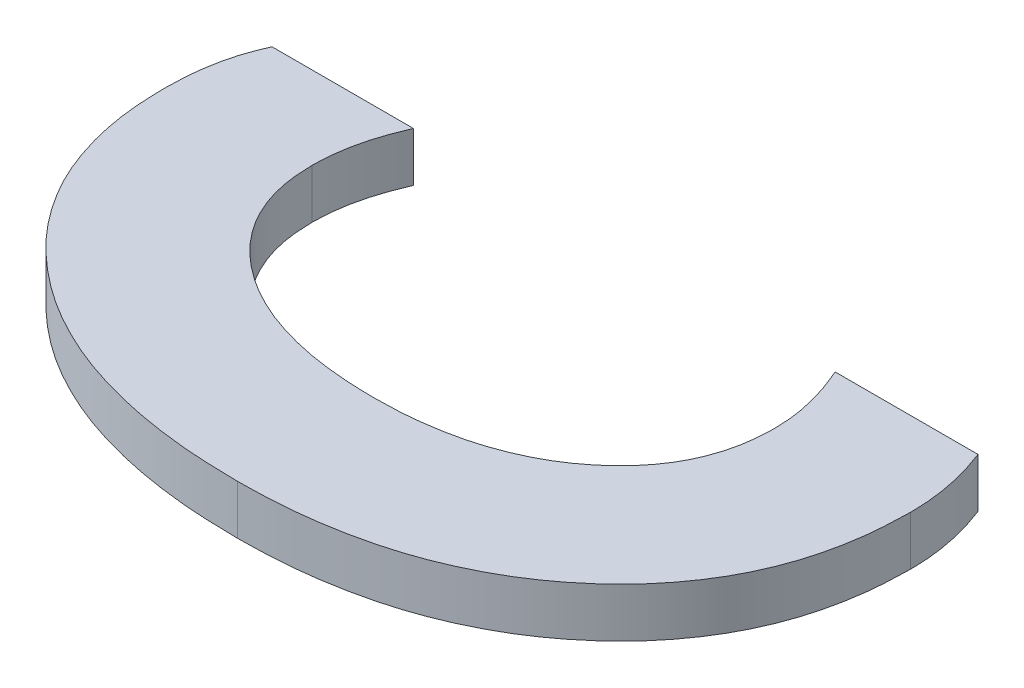
ISO-10303-21;
HEADER;
FILE_DESCRIPTION(('STEP AP214'),'2;1');
FILE_NAME('part.step','',(''),(''),'','','');
FILE_SCHEMA(('AUTOMOTIVE_DESIGN { 1 0 10303 214 1 1 1 1 }'));
ENDSEC;
DATA;
#1=APPLICATION_CONTEXT('core data for automotive mechanical design processes');
#2=APPLICATION_PROTOCOL_DEFINITION('international standard','automotive_design',2000,#1);
#3=PRODUCT_CONTEXT('',#1,'mechanical');
#4=PRODUCT('Part','Part','',(#3));
#5=PRODUCT_RELATED_PRODUCT_CATEGORY('part','',(#4));
#6=PRODUCT_DEFINITION_FORMATION('','',#4);
#7=PRODUCT_DEFINITION_CONTEXT('part definition',#1,'design');
#8=PRODUCT_DEFINITION('design','',#6,#7);
#9=PRODUCT_DEFINITION_SHAPE('','',#8);
#10=(LENGTH_UNIT() NAMED_UNIT(*) SI_UNIT(.MILLI.,.METRE.));
#11=(NAMED_UNIT(*) PLANE_ANGLE_UNIT() SI_UNIT($,.RADIAN.));
#12=(NAMED_UNIT(*) SI_UNIT($,.STERADIAN.) SOLID_ANGLE_UNIT());
#13=UNCERTAINTY_MEASURE_WITH_UNIT(LENGTH_MEASURE(1.E-05),#10,'distance_accuracy_value','');
#14=(GEOMETRIC_REPRESENTATION_CONTEXT(3) GLOBAL_UNCERTAINTY_ASSIGNED_CONTEXT((#13)) GLOBAL_UNIT_ASSIGNED_CONTEXT((#10,
#11,#12)) REPRESENTATION_CONTEXT('',''));
#15=CARTESIAN_POINT('',(0.,0.,0.));
#16=DIRECTION('',(0.,0.,1.));
#17=DIRECTION('',(1.,0.,0.));
#18=AXIS2_PLACEMENT_3D('',#15,#16,#17);
#19=CARTESIAN_POINT('',(2.3402597402597,2.9956,-1.9603896103896));
#20=DIRECTION('',(0.,0.,-1.));
#21=DIRECTION('',(0.,1.,0.));
#22=AXIS2_PLACEMENT_3D('',#19,#20,#21);
#23=PLANE('',#22);
#24=DIRECTION('',(1.,0.,0.));
#25=VECTOR('',#24,1.);
#26=CARTESIAN_POINT('',(2.3402597402597,2.9306,-1.9603896103896));
#27=LINE('',#26,#25);
#28=CARTESIAN_POINT('',(2.3402597402597,2.9306,-1.9603896103896));
#29=VERTEX_POINT('',#28);
#30=CARTESIAN_POINT('',(2.5284090909091,2.9306,-1.9603896103896));
#31=VERTEX_POINT('',#30);
#32=EDGE_CURVE('E11',#29,#31,#27,.T.);
#33=ORIENTED_EDGE('',*,*,#32,.F.);
#34=DIRECTION('',(0.,-1.,0.));
#35=VECTOR('',#34,1.);
#36=CARTESIAN_POINT('',(2.3402597402597,2.9956,-1.9603896103896));
#37=LINE('',#36,#35);
#38=CARTESIAN_POINT('',(2.3402597402597,2.9956,-1.9603896103896));
#39=VERTEX_POINT('',#38);
#40=EDGE_CURVE('E24',#39,#29,#37,.T.);
#41=ORIENTED_EDGE('',*,*,#40,.F.);
#42=DIRECTION('',(1.,0.,0.));
#43=VECTOR('',#42,1.);
#44=CARTESIAN_POINT('',(2.3402597402597,2.9956,-1.9603896103896));
#45=LINE('',#44,#43);
#46=CARTESIAN_POINT('',(2.5284090909091,2.9956,-1.9603896103896));
#47=VERTEX_POINT('',#46);
#48=EDGE_CURVE('E259',#39,#47,#45,.T.);
#49=ORIENTED_EDGE('',*,*,#48,.T.);
#50=DIRECTION('',(0.,-1.,0.));
#51=VECTOR('',#50,1.);
#52=CARTESIAN_POINT('',(2.5284090909091,2.9956,-1.9603896103896));
#53=LINE('',#52,#51);
#54=EDGE_CURVE('E114',#47,#31,#53,.T.);
#55=ORIENTED_EDGE('',*,*,#54,.T.);
#56=EDGE_LOOP('',(#33,#41,#49,#55));
#57=FACE_BOUND('',#56,.T.);
#58=ADVANCED_FACE('F17',(#57),#23,.T.);
#59=CARTESIAN_POINT('',(2.3649350649351,2.9956,-1.8557122564935));
#60=CARTESIAN_POINT('',(2.3649350649351,2.9306,-1.8557122564935));
#61=CARTESIAN_POINT('',(2.3646516452264,2.9956,-1.8642830245299));
#62=CARTESIAN_POINT('',(2.3646516452264,2.9306,-1.8642830245299));
#63=CARTESIAN_POINT('',(2.3640761804689,2.9956,-1.8816853956416));
#64=CARTESIAN_POINT('',(2.3640761804689,2.9306,-1.8816853956416));
#65=CARTESIAN_POINT('',(2.3588395500061,2.9956,-1.9078079689592));
#66=CARTESIAN_POINT('',(2.3588395500061,2.9306,-1.9078079689592));
#67=CARTESIAN_POINT('',(2.3512771652918,2.9956,-1.934333056613));
#68=CARTESIAN_POINT('',(2.3512771652918,2.9306,-1.934333056613));
#69=CARTESIAN_POINT('',(2.343980947344,2.9956,-1.9515888395903));
#70=CARTESIAN_POINT('',(2.343980947344,2.9306,-1.9515888395903));
#71=CARTESIAN_POINT('',(2.3402597402597,2.9956,-1.9603896103896));
#72=CARTESIAN_POINT('',(2.3402597402597,2.9306,-1.9603896103896));
#73=B_SPLINE_SURFACE_WITH_KNOTS('',3,1,((#59,#60),(#61,#62),(#63,#64),(#65,#66),(#67,#68),(#69,
#70),(#71,#72)),.UNSPECIFIED.,.F.,.F.,.F.,(4,1,1,1,4),(2,2),(0.,0.23716183637066,
0.481541242571344,0.735576374652706,1.),(0.,1.),.UNSPECIFIED.);
#74=CARTESIAN_POINT('',(2.3649350649351,2.9306,-1.8557122564935));
#75=CARTESIAN_POINT('',(2.3646516452264,2.9306,-1.8642830245299));
#76=CARTESIAN_POINT('',(2.3640761804689,2.9306,-1.8816853956416));
#77=CARTESIAN_POINT('',(2.3588395500061,2.9306,-1.9078079689592));
#78=CARTESIAN_POINT('',(2.3512771652918,2.9306,-1.934333056613));
#79=CARTESIAN_POINT('',(2.343980947344,2.9306,-1.9515888395903));
#80=CARTESIAN_POINT('',(2.3402597402597,2.9306,-1.9603896103896));
#81=B_SPLINE_CURVE_WITH_KNOTS('',3,(#74,#75,#76,#77,#78,#79,#80),.UNSPECIFIED.,.F.,.F.,(4,1,1,1,
4),(0.,0.23716183637066,0.481541242571344,0.735576374652706,1.),.UNSPECIFIED.);
#82=CARTESIAN_POINT('',(2.3649350649351,2.9306,-1.8557122564935));
#83=VERTEX_POINT('',#82);
#84=EDGE_CURVE('E251',#83,#29,#81,.T.);
#85=DIRECTION('',(0.,-1.,0.));
#86=VECTOR('',#85,1.);
#87=CARTESIAN_POINT('',(2.3649350649351,2.9956,-1.8557122564935));
#88=LINE('',#87,#86);
#89=CARTESIAN_POINT('',(2.3649350649351,2.9956,-1.8557122564935));
#90=VERTEX_POINT('',#89);
#91=EDGE_CURVE('E245',#90,#83,#88,.T.);
#92=CARTESIAN_POINT('',(2.3649350649351,2.9956,-1.8557122564935));
#93=CARTESIAN_POINT('',(2.3646516452264,2.9956,-1.8642830245299));
#94=CARTESIAN_POINT('',(2.3640761804689,2.9956,-1.8816853956416));
#95=CARTESIAN_POINT('',(2.3588395500061,2.9956,-1.9078079689592));
#96=CARTESIAN_POINT('',(2.3512771652918,2.9956,-1.934333056613));
#97=CARTESIAN_POINT('',(2.343980947344,2.9956,-1.9515888395903));
#98=CARTESIAN_POINT('',(2.3402597402597,2.9956,-1.9603896103896));
#99=B_SPLINE_CURVE_WITH_KNOTS('',3,(#92,#93,#94,#95,#96,#97,#98),.UNSPECIFIED.,.F.,.F.,(4,1,1,1,
4),(0.,0.23716183637066,0.481541242571344,0.735576374652706,1.),.UNSPECIFIED.);
#100=EDGE_CURVE('E237',#90,#39,#99,.T.);
#101=ORIENTED_EDGE('',*,*,#84,.F.);
#102=ORIENTED_EDGE('',*,*,#91,.F.);
#103=ORIENTED_EDGE('',*,*,#100,.T.);
#104=ORIENTED_EDGE('',*,*,#40,.T.);
#105=EDGE_LOOP('',(#101,#102,#103,#104));
#106=FACE_BOUND('',#105,.T.);
#107=ADVANCED_FACE('F261',(#106),#73,.T.);
#108=CARTESIAN_POINT('',(2.0665178571429,2.9956,-1.6272727272727));
#109=CARTESIAN_POINT('',(2.0665178571429,2.9306,-1.6272727272727));
#110=CARTESIAN_POINT('',(2.0773855002626,2.9956,-1.6274322584116));
#111=CARTESIAN_POINT('',(2.0773855002626,2.9306,-1.6274322584116));
#112=CARTESIAN_POINT('',(2.0986527906697,2.9956,-1.6277444507628));
#113=CARTESIAN_POINT('',(2.0986527906697,2.9306,-1.6277444507628));
#114=CARTESIAN_POINT('',(2.1296985897034,2.9956,-1.6309267728761));
#115=CARTESIAN_POINT('',(2.1296985897034,2.9306,-1.6309267728761));
#116=CARTESIAN_POINT('',(2.1591421145793,2.9956,-1.6359050280684));
#117=CARTESIAN_POINT('',(2.1591421145793,2.9306,-1.6359050280684));
#118=CARTESIAN_POINT('',(2.1870393043749,2.9956,-1.6427727970921));
#119=CARTESIAN_POINT('',(2.1870393043749,2.9306,-1.6427727970921));
#120=CARTESIAN_POINT('',(2.2133258583675,2.9956,-1.651894046036));
#121=CARTESIAN_POINT('',(2.2133258583675,2.9306,-1.651894046036));
#122=CARTESIAN_POINT('',(2.2380710195503,2.9956,-1.6628415214763));
#123=CARTESIAN_POINT('',(2.2380710195503,2.9306,-1.6628415214763));
#124=CARTESIAN_POINT('',(2.2612188226648,2.9956,-1.675828590491));
#125=CARTESIAN_POINT('',(2.2612188226648,2.9306,-1.675828590491));
#126=CARTESIAN_POINT('',(2.2824861032711,2.9956,-1.6908034745585));
#127=CARTESIAN_POINT('',(2.2824861032711,2.9306,-1.6908034745585));
#128=CARTESIAN_POINT('',(2.3017538930147,2.9956,-1.7073074147526));
#129=CARTESIAN_POINT('',(2.3017538930147,2.9306,-1.7073074147526));
#130=CARTESIAN_POINT('',(2.3186528428061,2.9956,-1.7251139200052));
#131=CARTESIAN_POINT('',(2.3186528428061,2.9306,-1.7251139200052));
#132=CARTESIAN_POINT('',(2.3330044543137,2.9956,-1.7440259148456));
#133=CARTESIAN_POINT('',(2.3330044543137,2.9306,-1.7440259148456));
#134=CARTESIAN_POINT('',(2.3447441725659,2.9956,-1.7641453270794));
#135=CARTESIAN_POINT('',(2.3447441725659,2.9306,-1.7641453270794));
#136=CARTESIAN_POINT('',(2.3538355106017,2.9956,-1.7853807912623));
#137=CARTESIAN_POINT('',(2.3538355106017,2.9306,-1.7853807912623));
#138=CARTESIAN_POINT('',(2.3602086092565,2.9956,-1.8078630183926));
#139=CARTESIAN_POINT('',(2.3602086092565,2.9306,-1.8078630183926));
#140=CARTESIAN_POINT('',(2.3641429361599,2.9956,-1.8314128314518));
#141=CARTESIAN_POINT('',(2.3641429361599,2.9306,-1.8314128314518));
#142=CARTESIAN_POINT('',(2.3646685323511,2.9956,-1.8475360751111));
#143=CARTESIAN_POINT('',(2.3646685323511,2.9306,-1.8475360751111));
#144=CARTESIAN_POINT('',(2.3649350649351,2.9956,-1.8557122564935));
#145=CARTESIAN_POINT('',(2.3649350649351,2.9306,-1.8557122564935));
#146=B_SPLINE_SURFACE_WITH_KNOTS('',3,1,((#108,#109),(#110,#111),(#112,#113),(#114,#115),(#116,
#117),(#118,#119),(#120,#121),(#122,#123),(#124,#125),(#126,#127),(#128,#129),(#130,#131),(#132,
#133),(#134,#135),(#136,#137),(#138,#139),(#140,#141),(#142,#143),(#144,#145)),.UNSPECIFIED.,
.F.,.F.,.F.,(4,1,1,1,1,1,1,1,1,1,1,1,1,1,1,1,4),(2,2),(0.,0.0775445214945562,0.151749725301288,
0.222475929546949,0.290553082861427,0.35654823633205,0.420812237081041,0.483446770096068,
0.545668536578931,0.606160701180748,0.664234712114714,0.720556326720081,0.775227221620043,
0.830090160440384,0.884962683813622,0.941663973902234,1.),(0.,1.),.UNSPECIFIED.);
#147=CARTESIAN_POINT('',(2.0665178571429,2.9306,-1.6272727272727));
#148=CARTESIAN_POINT('',(2.0773855002626,2.9306,-1.6274322584116));
#149=CARTESIAN_POINT('',(2.0986527906697,2.9306,-1.6277444507628));
#150=CARTESIAN_POINT('',(2.1296985897034,2.9306,-1.6309267728761));
#151=CARTESIAN_POINT('',(2.1591421145793,2.9306,-1.6359050280684));
#152=CARTESIAN_POINT('',(2.1870393043749,2.9306,-1.6427727970921));
#153=CARTESIAN_POINT('',(2.2133258583675,2.9306,-1.651894046036));
#154=CARTESIAN_POINT('',(2.2380710195503,2.9306,-1.6628415214763));
#155=CARTESIAN_POINT('',(2.2612188226648,2.9306,-1.675828590491));
#156=CARTESIAN_POINT('',(2.2824861032711,2.9306,-1.6908034745585));
#157=CARTESIAN_POINT('',(2.3017538930147,2.9306,-1.7073074147526));
#158=CARTESIAN_POINT('',(2.3186528428061,2.9306,-1.7251139200052));
#159=CARTESIAN_POINT('',(2.3330044543137,2.9306,-1.7440259148456));
#160=CARTESIAN_POINT('',(2.3447441725659,2.9306,-1.7641453270794));
#161=CARTESIAN_POINT('',(2.3538355106017,2.9306,-1.7853807912623));
#162=CARTESIAN_POINT('',(2.3602086092565,2.9306,-1.8078630183926));
#163=CARTESIAN_POINT('',(2.3641429361599,2.9306,-1.8314128314518));
#164=CARTESIAN_POINT('',(2.3646685323511,2.9306,-1.8475360751111));
#165=CARTESIAN_POINT('',(2.3649350649351,2.9306,-1.8557122564935));
#166=B_SPLINE_CURVE_WITH_KNOTS('',3,(#147,#148,#149,#150,#151,#152,#153,#154,#155,#156,#157,
#158,#159,#160,#161,#162,#163,#164,#165),.UNSPECIFIED.,.F.,.F.,(4,1,1,1,1,1,1,1,1,1,1,1,1,1,1,1,
4),(0.,0.0775445214945562,0.151749725301288,0.222475929546949,0.290553082861427,
0.35654823633205,0.420812237081041,0.483446770096068,0.545668536578931,0.606160701180748,
0.664234712114714,0.720556326720081,0.775227221620043,0.830090160440384,0.884962683813622,
0.941663973902234,1.),.UNSPECIFIED.);
#167=CARTESIAN_POINT('',(2.0665178571429,2.9306,-1.6272727272727));
#168=VERTEX_POINT('',#167);
#169=EDGE_CURVE('E232',#168,#83,#166,.T.);
#170=DIRECTION('',(0.,-1.,0.));
#171=VECTOR('',#170,1.);
#172=CARTESIAN_POINT('',(2.0665178571429,2.9956,-1.6272727272727));
#173=LINE('',#172,#171);
#174=CARTESIAN_POINT('',(2.0665178571429,2.9956,-1.6272727272727));
#175=VERTEX_POINT('',#174);
#176=EDGE_CURVE('E226',#175,#168,#173,.T.);
#177=CARTESIAN_POINT('',(2.0665178571429,2.9956,-1.6272727272727));
#178=CARTESIAN_POINT('',(2.0773855002626,2.9956,-1.6274322584116));
#179=CARTESIAN_POINT('',(2.0986527906697,2.9956,-1.6277444507628));
#180=CARTESIAN_POINT('',(2.1296985897034,2.9956,-1.6309267728761));
#181=CARTESIAN_POINT('',(2.1591421145793,2.9956,-1.6359050280684));
#182=CARTESIAN_POINT('',(2.1870393043749,2.9956,-1.6427727970921));
#183=CARTESIAN_POINT('',(2.2133258583675,2.9956,-1.651894046036));
#184=CARTESIAN_POINT('',(2.2380710195503,2.9956,-1.6628415214763));
#185=CARTESIAN_POINT('',(2.2612188226648,2.9956,-1.675828590491));
#186=CARTESIAN_POINT('',(2.2824861032711,2.9956,-1.6908034745585));
#187=CARTESIAN_POINT('',(2.3017538930147,2.9956,-1.7073074147526));
#188=CARTESIAN_POINT('',(2.3186528428061,2.9956,-1.7251139200052));
#189=CARTESIAN_POINT('',(2.3330044543137,2.9956,-1.7440259148456));
#190=CARTESIAN_POINT('',(2.3447441725659,2.9956,-1.7641453270794));
#191=CARTESIAN_POINT('',(2.3538355106017,2.9956,-1.7853807912623));
#192=CARTESIAN_POINT('',(2.3602086092565,2.9956,-1.8078630183926));
#193=CARTESIAN_POINT('',(2.3641429361599,2.9956,-1.8314128314518));
#194=CARTESIAN_POINT('',(2.3646685323511,2.9956,-1.8475360751111));
#195=CARTESIAN_POINT('',(2.3649350649351,2.9956,-1.8557122564935));
#196=B_SPLINE_CURVE_WITH_KNOTS('',3,(#177,#178,#179,#180,#181,#182,#183,#184,#185,#186,#187,
#188,#189,#190,#191,#192,#193,#194,#195),.UNSPECIFIED.,.F.,.F.,(4,1,1,1,1,1,1,1,1,1,1,1,1,1,1,1,
4),(0.,0.0775445214945562,0.151749725301288,0.222475929546949,0.290553082861427,
0.35654823633205,0.420812237081041,0.483446770096068,0.545668536578931,0.606160701180748,
0.664234712114714,0.720556326720081,0.775227221620043,0.830090160440384,0.884962683813622,
0.941663973902234,1.),.UNSPECIFIED.);
#197=EDGE_CURVE('E218',#175,#90,#196,.T.);
#198=ORIENTED_EDGE('',*,*,#169,.F.);
#199=ORIENTED_EDGE('',*,*,#176,.F.);
#200=ORIENTED_EDGE('',*,*,#197,.T.);
#201=ORIENTED_EDGE('',*,*,#91,.T.);
#202=EDGE_LOOP('',(#198,#199,#200,#201));
#203=FACE_BOUND('',#202,.T.);
#204=ADVANCED_FACE('F265',(#203),#146,.T.);
#205=CARTESIAN_POINT('',(1.7603896103896,2.9956,-1.851663961039));
#206=CARTESIAN_POINT('',(1.7603896103896,2.9306,-1.851663961039));
#207=CARTESIAN_POINT('',(1.7606600615359,2.9956,-1.8435528285198));
#208=CARTESIAN_POINT('',(1.7606600615359,2.9306,-1.8435528285198));
#209=CARTESIAN_POINT('',(1.7611933502631,2.9956,-1.8275589028226));
#210=CARTESIAN_POINT('',(1.7611933502631,2.9306,-1.8275589028226));
#211=CARTESIAN_POINT('',(1.7650739435199,2.9956,-1.8041694017406));
#212=CARTESIAN_POINT('',(1.7650739435199,2.9306,-1.8041694017406));
#213=CARTESIAN_POINT('',(1.7716544947004,2.9956,-1.7819415835035));
#214=CARTESIAN_POINT('',(1.7716544947004,2.9306,-1.7819415835035));
#215=CARTESIAN_POINT('',(1.7810306703198,2.9956,-1.761011071647));
#216=CARTESIAN_POINT('',(1.7810306703198,2.9306,-1.761011071647));
#217=CARTESIAN_POINT('',(1.7928509275754,2.9956,-1.7411425514334));
#218=CARTESIAN_POINT('',(1.7928509275754,2.9306,-1.7411425514334));
#219=CARTESIAN_POINT('',(1.8074762111279,2.9956,-1.7226072707774));
#220=CARTESIAN_POINT('',(1.8074762111279,2.9306,-1.7226072707774));
#221=CARTESIAN_POINT('',(1.8245657174604,2.9956,-1.7051139419819));
#222=CARTESIAN_POINT('',(1.8245657174604,2.9306,-1.7051139419819));
#223=CARTESIAN_POINT('',(1.844227484472,2.9956,-1.6890786736688));
#224=CARTESIAN_POINT('',(1.844227484472,2.9306,-1.6890786736688));
#225=CARTESIAN_POINT('',(1.8658889344819,2.9956,-1.6743910632406));
#226=CARTESIAN_POINT('',(1.8658889344819,2.9306,-1.6743910632406));
#227=CARTESIAN_POINT('',(1.8896517649794,2.9956,-1.6619400654834));
#228=CARTESIAN_POINT('',(1.8896517649794,2.9306,-1.6619400654834));
#229=CARTESIAN_POINT('',(1.9149078044388,2.9956,-1.6509958515217));
#230=CARTESIAN_POINT('',(1.9149078044388,2.9306,-1.6509958515217));
#231=CARTESIAN_POINT('',(1.9420425469413,2.9956,-1.6425230590816));
#232=CARTESIAN_POINT('',(1.9420425469413,2.9306,-1.6425230590816));
#233=CARTESIAN_POINT('',(1.9707119984812,2.9956,-1.6353911459008));
#234=CARTESIAN_POINT('',(1.9707119984812,2.9306,-1.6353911459008));
#235=CARTESIAN_POINT('',(2.0011743412063,2.9956,-1.630776527762));
#236=CARTESIAN_POINT('',(2.0011743412063,2.9306,-1.630776527762));
#237=CARTESIAN_POINT('',(2.0332999424843,2.9956,-1.6277811125942));
#238=CARTESIAN_POINT('',(2.0332999424843,2.9306,-1.6277811125942));
#239=CARTESIAN_POINT('',(2.0552653577627,2.9956,-1.6274449417411));
#240=CARTESIAN_POINT('',(2.0552653577627,2.9306,-1.6274449417411));
#241=CARTESIAN_POINT('',(2.0665178571429,2.9956,-1.6272727272727));
#242=CARTESIAN_POINT('',(2.0665178571429,2.9306,-1.6272727272727));
#243=B_SPLINE_SURFACE_WITH_KNOTS('',3,1,((#205,#206),(#207,#208),(#209,#210),(#211,#212),(#213,
#214),(#215,#216),(#217,#218),(#219,#220),(#221,#222),(#223,#224),(#225,#226),(#227,#228),(#229,
#230),(#231,#232),(#233,#234),(#235,#236),(#237,#238),(#239,#240),(#241,#242)),.UNSPECIFIED.,
.F.,.F.,.F.,(4,1,1,1,1,1,1,1,1,1,1,1,1,1,1,1,4),(2,2),(0.,0.0572924959307924,0.112972130679967,
0.166981229647898,0.220638074956462,0.274595628493794,0.329903838679954,0.387050444241429,
0.447040621025498,0.508866662501777,0.571625805181683,0.636306391481121,0.703069427859231,
0.772220993057641,0.844845747875827,0.920517181044396,1.),(0.,1.),.UNSPECIFIED.);
#244=CARTESIAN_POINT('',(1.7603896103896,2.9306,-1.851663961039));
#245=CARTESIAN_POINT('',(1.7606600615359,2.9306,-1.8435528285198));
#246=CARTESIAN_POINT('',(1.7611933502631,2.9306,-1.8275589028226));
#247=CARTESIAN_POINT('',(1.7650739435199,2.9306,-1.8041694017406));
#248=CARTESIAN_POINT('',(1.7716544947004,2.9306,-1.7819415835035));
#249=CARTESIAN_POINT('',(1.7810306703198,2.9306,-1.761011071647));
#250=CARTESIAN_POINT('',(1.7928509275754,2.9306,-1.7411425514334));
#251=CARTESIAN_POINT('',(1.8074762111279,2.9306,-1.7226072707774));
#252=CARTESIAN_POINT('',(1.8245657174604,2.9306,-1.7051139419819));
#253=CARTESIAN_POINT('',(1.844227484472,2.9306,-1.6890786736688));
#254=CARTESIAN_POINT('',(1.8658889344819,2.9306,-1.6743910632406));
#255=CARTESIAN_POINT('',(1.8896517649794,2.9306,-1.6619400654834));
#256=CARTESIAN_POINT('',(1.9149078044388,2.9306,-1.6509958515217));
#257=CARTESIAN_POINT('',(1.9420425469413,2.9306,-1.6425230590816));
#258=CARTESIAN_POINT('',(1.9707119984812,2.9306,-1.6353911459008));
#259=CARTESIAN_POINT('',(2.0011743412063,2.9306,-1.630776527762));
#260=CARTESIAN_POINT('',(2.0332999424843,2.9306,-1.6277811125942));
#261=CARTESIAN_POINT('',(2.0552653577627,2.9306,-1.6274449417411));
#262=CARTESIAN_POINT('',(2.0665178571429,2.9306,-1.6272727272727));
#263=B_SPLINE_CURVE_WITH_KNOTS('',3,(#244,#245,#246,#247,#248,#249,#250,#251,#252,#253,#254,
#255,#256,#257,#258,#259,#260,#261,#262),.UNSPECIFIED.,.F.,.F.,(4,1,1,1,1,1,1,1,1,1,1,1,1,1,1,1,
4),(0.,0.0572924959307924,0.112972130679967,0.166981229647898,0.220638074956462,
0.274595628493794,0.329903838679954,0.387050444241429,0.447040621025498,0.508866662501777,
0.571625805181683,0.636306391481121,0.703069427859231,0.772220993057641,0.844845747875827,
0.920517181044396,1.),.UNSPECIFIED.);
#264=CARTESIAN_POINT('',(1.7603896103896,2.9306,-1.851663961039));
#265=VERTEX_POINT('',#264);
#266=EDGE_CURVE('E213',#265,#168,#263,.T.);
#267=DIRECTION('',(0.,-1.,0.));
#268=VECTOR('',#267,1.);
#269=CARTESIAN_POINT('',(1.7603896103896,2.9956,-1.851663961039));
#270=LINE('',#269,#268);
#271=CARTESIAN_POINT('',(1.7603896103896,2.9956,-1.851663961039));
#272=VERTEX_POINT('',#271);
#273=EDGE_CURVE('E207',#272,#265,#270,.T.);
#274=CARTESIAN_POINT('',(1.7603896103896,2.9956,-1.851663961039));
#275=CARTESIAN_POINT('',(1.7606600615359,2.9956,-1.8435528285198));
#276=CARTESIAN_POINT('',(1.7611933502631,2.9956,-1.8275589028226));
#277=CARTESIAN_POINT('',(1.7650739435199,2.9956,-1.8041694017406));
#278=CARTESIAN_POINT('',(1.7716544947004,2.9956,-1.7819415835035));
#279=CARTESIAN_POINT('',(1.7810306703198,2.9956,-1.761011071647));
#280=CARTESIAN_POINT('',(1.7928509275754,2.9956,-1.7411425514334));
#281=CARTESIAN_POINT('',(1.8074762111279,2.9956,-1.7226072707774));
#282=CARTESIAN_POINT('',(1.8245657174604,2.9956,-1.7051139419819));
#283=CARTESIAN_POINT('',(1.844227484472,2.9956,-1.6890786736688));
#284=CARTESIAN_POINT('',(1.8658889344819,2.9956,-1.6743910632406));
#285=CARTESIAN_POINT('',(1.8896517649794,2.9956,-1.6619400654834));
#286=CARTESIAN_POINT('',(1.9149078044388,2.9956,-1.6509958515217));
#287=CARTESIAN_POINT('',(1.9420425469413,2.9956,-1.6425230590816));
#288=CARTESIAN_POINT('',(1.9707119984812,2.9956,-1.6353911459008));
#289=CARTESIAN_POINT('',(2.0011743412063,2.9956,-1.630776527762));
#290=CARTESIAN_POINT('',(2.0332999424843,2.9956,-1.6277811125942));
#291=CARTESIAN_POINT('',(2.0552653577627,2.9956,-1.6274449417411));
#292=CARTESIAN_POINT('',(2.0665178571429,2.9956,-1.6272727272727));
#293=B_SPLINE_CURVE_WITH_KNOTS('',3,(#274,#275,#276,#277,#278,#279,#280,#281,#282,#283,#284,
#285,#286,#287,#288,#289,#290,#291,#292),.UNSPECIFIED.,.F.,.F.,(4,1,1,1,1,1,1,1,1,1,1,1,1,1,1,1,
4),(0.,0.0572924959307924,0.112972130679967,0.166981229647898,0.220638074956462,
0.274595628493794,0.329903838679954,0.387050444241429,0.447040621025498,0.508866662501777,
0.571625805181683,0.636306391481121,0.703069427859231,0.772220993057641,0.844845747875827,
0.920517181044396,1.),.UNSPECIFIED.);
#294=EDGE_CURVE('E199',#272,#175,#293,.T.);
#295=ORIENTED_EDGE('',*,*,#266,.F.);
#296=ORIENTED_EDGE('',*,*,#273,.F.);
#297=ORIENTED_EDGE('',*,*,#294,.T.);
#298=ORIENTED_EDGE('',*,*,#176,.T.);
#299=EDGE_LOOP('',(#295,#296,#297,#298));
#300=FACE_BOUND('',#299,.T.);
#301=ADVANCED_FACE('F268',(#300),#243,.T.);
#302=CARTESIAN_POINT('',(1.7850649350649,2.9956,-1.9603896103896));
#303=CARTESIAN_POINT('',(1.7850649350649,2.9306,-1.9603896103896));
#304=CARTESIAN_POINT('',(1.7812110797635,2.9956,-1.9510120387157));
#305=CARTESIAN_POINT('',(1.7812110797635,2.9306,-1.9510120387157));
#306=CARTESIAN_POINT('',(1.773751175068,2.9956,-1.9328598805546));
#307=CARTESIAN_POINT('',(1.773751175068,2.9306,-1.9328598805546));
#308=CARTESIAN_POINT('',(1.7659874126836,2.9956,-1.9052031918598));
#309=CARTESIAN_POINT('',(1.7659874126836,2.9306,-1.9052031918598));
#310=CARTESIAN_POINT('',(1.7613751922113,2.9956,-1.8782313353698));
#311=CARTESIAN_POINT('',(1.7613751922113,2.9306,-1.8782313353698));
#312=CARTESIAN_POINT('',(1.7607144380481,2.9956,-1.8604200255344));
#313=CARTESIAN_POINT('',(1.7607144380481,2.9306,-1.8604200255344));
#314=CARTESIAN_POINT('',(1.7603896103896,2.9956,-1.851663961039));
#315=CARTESIAN_POINT('',(1.7603896103896,2.9306,-1.851663961039));
#316=B_SPLINE_SURFACE_WITH_KNOTS('',3,1,((#302,#303),(#304,#305),(#306,#307),(#308,#309),(#310,
#311),(#312,#313),(#314,#315)),.UNSPECIFIED.,.F.,.F.,.F.,(4,1,1,1,4),(2,2),(0.,
0.270753871936456,0.524098058327029,0.766045948707751,1.),(0.,1.),.UNSPECIFIED.);
#317=CARTESIAN_POINT('',(1.7850649350649,2.9306,-1.9603896103896));
#318=CARTESIAN_POINT('',(1.7812110797635,2.9306,-1.9510120387157));
#319=CARTESIAN_POINT('',(1.773751175068,2.9306,-1.9328598805546));
#320=CARTESIAN_POINT('',(1.7659874126836,2.9306,-1.9052031918598));
#321=CARTESIAN_POINT('',(1.7613751922113,2.9306,-1.8782313353698));
#322=CARTESIAN_POINT('',(1.7607144380481,2.9306,-1.8604200255344));
#323=CARTESIAN_POINT('',(1.7603896103896,2.9306,-1.851663961039));
#324=B_SPLINE_CURVE_WITH_KNOTS('',3,(#317,#318,#319,#320,#321,#322,#323),.UNSPECIFIED.,.F.,.F.,
(4,1,1,1,4),(0.,0.270753871936456,0.524098058327029,0.766045948707751,1.),.UNSPECIFIED.);
#325=CARTESIAN_POINT('',(1.7850649350649,2.9306,-1.9603896103896));
#326=VERTEX_POINT('',#325);
#327=EDGE_CURVE('E194',#326,#265,#324,.T.);
#328=DIRECTION('',(0.,-1.,0.));
#329=VECTOR('',#328,1.);
#330=CARTESIAN_POINT('',(1.7850649350649,2.9956,-1.9603896103896));
#331=LINE('',#330,#329);
#332=CARTESIAN_POINT('',(1.7850649350649,2.9956,-1.9603896103896));
#333=VERTEX_POINT('',#332);
#334=EDGE_CURVE('E188',#333,#326,#331,.T.);
#335=CARTESIAN_POINT('',(1.7850649350649,2.9956,-1.9603896103896));
#336=CARTESIAN_POINT('',(1.7812110797635,2.9956,-1.9510120387157));
#337=CARTESIAN_POINT('',(1.773751175068,2.9956,-1.9328598805546));
#338=CARTESIAN_POINT('',(1.7659874126836,2.9956,-1.9052031918598));
#339=CARTESIAN_POINT('',(1.7613751922113,2.9956,-1.8782313353698));
#340=CARTESIAN_POINT('',(1.7607144380481,2.9956,-1.8604200255344));
#341=CARTESIAN_POINT('',(1.7603896103896,2.9956,-1.851663961039));
#342=B_SPLINE_CURVE_WITH_KNOTS('',3,(#335,#336,#337,#338,#339,#340,#341),.UNSPECIFIED.,.F.,.F.,
(4,1,1,1,4),(0.,0.270753871936456,0.524098058327029,0.766045948707751,1.),.UNSPECIFIED.);
#343=EDGE_CURVE('E183',#333,#272,#342,.T.);
#344=ORIENTED_EDGE('',*,*,#327,.F.);
#345=ORIENTED_EDGE('',*,*,#334,.F.);
#346=ORIENTED_EDGE('',*,*,#343,.T.);
#347=ORIENTED_EDGE('',*,*,#273,.T.);
#348=EDGE_LOOP('',(#344,#345,#346,#347));
#349=FACE_BOUND('',#348,.T.);
#350=ADVANCED_FACE('F273',(#349),#316,.T.);
#351=CARTESIAN_POINT('',(1.5988433441558,2.9956,-1.9603896103896));
#352=DIRECTION('',(0.,0.,-1.));
#353=DIRECTION('',(0.,1.,0.));
#354=AXIS2_PLACEMENT_3D('',#351,#352,#353);
#355=PLANE('',#354);
#356=DIRECTION('',(1.,0.,0.));
#357=VECTOR('',#356,1.);
#358=CARTESIAN_POINT('',(1.5988433441558,2.9306,-1.9603896103896));
#359=LINE('',#358,#357);
#360=CARTESIAN_POINT('',(1.5988433441558,2.9306,-1.9603896103896));
#361=VERTEX_POINT('',#360);
#362=EDGE_CURVE('E180',#361,#326,#359,.T.);
#363=ORIENTED_EDGE('',*,*,#362,.F.);
#364=DIRECTION('',(0.,-1.,0.));
#365=VECTOR('',#364,1.);
#366=CARTESIAN_POINT('',(1.5988433441558,2.9956,-1.9603896103896));
#367=LINE('',#366,#365);
#368=CARTESIAN_POINT('',(1.5988433441558,2.9956,-1.9603896103896));
#369=VERTEX_POINT('',#368);
#370=EDGE_CURVE('E177',#369,#361,#367,.T.);
#371=ORIENTED_EDGE('',*,*,#370,.F.);
#372=DIRECTION('',(1.,0.,0.));
#373=VECTOR('',#372,1.);
#374=CARTESIAN_POINT('',(1.5988433441558,2.9956,-1.9603896103896));
#375=LINE('',#374,#373);
#376=EDGE_CURVE('E171',#369,#333,#375,.T.);
#377=ORIENTED_EDGE('',*,*,#376,.T.);
#378=ORIENTED_EDGE('',*,*,#334,.T.);
#379=EDGE_LOOP('',(#363,#371,#377,#378));
#380=FACE_BOUND('',#379,.T.);
#381=ADVANCED_FACE('F275',(#380),#355,.T.);
#382=CARTESIAN_POINT('',(1.5753246753247,2.9956,-1.8422179383117));
#383=CARTESIAN_POINT('',(1.5753246753247,2.9306,-1.8422179383117));
#384=CARTESIAN_POINT('',(1.5755476795032,2.9956,-1.8529661008444));
#385=CARTESIAN_POINT('',(1.5755476795032,2.9306,-1.8529661008444));
#386=CARTESIAN_POINT('',(1.575980875706,2.9956,-1.8738449167806));
#387=CARTESIAN_POINT('',(1.575980875706,2.9306,-1.8738449167806));
#388=CARTESIAN_POINT('',(1.5804027468027,2.9956,-1.9043286493301));
#389=CARTESIAN_POINT('',(1.5804027468027,2.9306,-1.9043286493301));
#390=CARTESIAN_POINT('',(1.5874498552226,2.9956,-1.9333151613331));
#391=CARTESIAN_POINT('',(1.5874498552226,2.9306,-1.9333151613331));
#392=CARTESIAN_POINT('',(1.5950656660256,2.9956,-1.9514126802598));
#393=CARTESIAN_POINT('',(1.5950656660256,2.9306,-1.9514126802598));
#394=CARTESIAN_POINT('',(1.5988433441558,2.9956,-1.9603896103896));
#395=CARTESIAN_POINT('',(1.5988433441558,2.9306,-1.9603896103896));
#396=B_SPLINE_SURFACE_WITH_KNOTS('',3,1,((#382,#383),(#384,#385),(#386,#387),(#388,#389),(#390,
#391),(#392,#393),(#394,#395)),.UNSPECIFIED.,.F.,.F.,.F.,(4,1,1,1,4),(2,2),(0.,
0.265393485193272,0.515539443245717,0.759692553092044,1.),(0.,1.),.UNSPECIFIED.);
#397=CARTESIAN_POINT('',(1.5753246753247,2.9306,-1.8422179383117));
#398=CARTESIAN_POINT('',(1.5755476795032,2.9306,-1.8529661008444));
#399=CARTESIAN_POINT('',(1.575980875706,2.9306,-1.8738449167806));
#400=CARTESIAN_POINT('',(1.5804027468027,2.9306,-1.9043286493301));
#401=CARTESIAN_POINT('',(1.5874498552226,2.9306,-1.9333151613331));
#402=CARTESIAN_POINT('',(1.5950656660256,2.9306,-1.9514126802598));
#403=CARTESIAN_POINT('',(1.5988433441558,2.9306,-1.9603896103896));
#404=B_SPLINE_CURVE_WITH_KNOTS('',3,(#397,#398,#399,#400,#401,#402,#403),.UNSPECIFIED.,.F.,.F.,
(4,1,1,1,4),(0.,0.265393485193272,0.515539443245717,0.759692553092044,1.),.UNSPECIFIED.);
#405=CARTESIAN_POINT('',(1.5753246753247,2.9306,-1.8422179383117));
#406=VERTEX_POINT('',#405);
#407=EDGE_CURVE('E166',#406,#361,#404,.T.);
#408=DIRECTION('',(0.,-1.,0.));
#409=VECTOR('',#408,1.);
#410=CARTESIAN_POINT('',(1.5753246753247,2.9956,-1.8422179383117));
#411=LINE('',#410,#409);
#412=CARTESIAN_POINT('',(1.5753246753247,2.9956,-1.8422179383117));
#413=VERTEX_POINT('',#412);
#414=EDGE_CURVE('E160',#413,#406,#411,.T.);
#415=CARTESIAN_POINT('',(1.5753246753247,2.9956,-1.8422179383117));
#416=CARTESIAN_POINT('',(1.5755476795032,2.9956,-1.8529661008444));
#417=CARTESIAN_POINT('',(1.575980875706,2.9956,-1.8738449167806));
#418=CARTESIAN_POINT('',(1.5804027468027,2.9956,-1.9043286493301));
#419=CARTESIAN_POINT('',(1.5874498552226,2.9956,-1.9333151613331));
#420=CARTESIAN_POINT('',(1.5950656660256,2.9956,-1.9514126802598));
#421=CARTESIAN_POINT('',(1.5988433441558,2.9956,-1.9603896103896));
#422=B_SPLINE_CURVE_WITH_KNOTS('',3,(#415,#416,#417,#418,#419,#420,#421),.UNSPECIFIED.,.F.,.F.,
(4,1,1,1,4),(0.,0.265393485193272,0.515539443245717,0.759692553092044,1.),.UNSPECIFIED.);
#423=EDGE_CURVE('E152',#413,#369,#422,.T.);
#424=ORIENTED_EDGE('',*,*,#407,.F.);
#425=ORIENTED_EDGE('',*,*,#414,.F.);
#426=ORIENTED_EDGE('',*,*,#423,.T.);
#427=ORIENTED_EDGE('',*,*,#370,.T.);
#428=EDGE_LOOP('',(#424,#425,#426,#427));
#429=FACE_BOUND('',#428,.T.);
#430=ADVANCED_FACE('F277',(#429),#396,.T.);
#431=CARTESIAN_POINT('',(2.0715300324675,2.9956,-1.4422077922078));
#432=CARTESIAN_POINT('',(2.0715300324675,2.9306,-1.4422077922078));
#433=CARTESIAN_POINT('',(2.0533958209849,2.9956,-1.4425239848561));
#434=CARTESIAN_POINT('',(2.0533958209849,2.9306,-1.4425239848561));
#435=CARTESIAN_POINT('',(2.0179492528565,2.9956,-1.4431420400861));
#436=CARTESIAN_POINT('',(2.0179492528565,2.9306,-1.4431420400861));
#437=CARTESIAN_POINT('',(1.966146366743,2.9956,-1.4484592470915));
#438=CARTESIAN_POINT('',(1.966146366743,2.9306,-1.4484592470915));
#439=CARTESIAN_POINT('',(1.9170078397133,2.9956,-1.457011137358));
#440=CARTESIAN_POINT('',(1.9170078397133,2.9306,-1.457011137358));
#441=CARTESIAN_POINT('',(1.8706131038443,2.9956,-1.4692250988088));
#442=CARTESIAN_POINT('',(1.8706131038443,2.9306,-1.4692250988088));
#443=CARTESIAN_POINT('',(1.8267435014486,2.9956,-1.4845071825498));
#444=CARTESIAN_POINT('',(1.8267435014486,2.9306,-1.4845071825498));
#445=CARTESIAN_POINT('',(1.7857621218904,2.9956,-1.50382500915));
#446=CARTESIAN_POINT('',(1.7857621218904,2.9306,-1.50382500915));
#447=CARTESIAN_POINT('',(1.7471288959907,2.9956,-1.5260551108983));
#448=CARTESIAN_POINT('',(1.7471288959907,2.9306,-1.5260551108983));
#449=CARTESIAN_POINT('',(1.711834732507,2.9956,-1.5521352211196));
#450=CARTESIAN_POINT('',(1.711834732507,2.9306,-1.5521352211196));
#451=CARTESIAN_POINT('',(1.679832543597,2.9956,-1.5806930524343));
#452=CARTESIAN_POINT('',(1.679832543597,2.9306,-1.5806930524343));
#453=CARTESIAN_POINT('',(1.6517751348281,2.9956,-1.6116955713276));
#454=CARTESIAN_POINT('',(1.6517751348281,2.9306,-1.6116955713276));
#455=CARTESIAN_POINT('',(1.6282104814113,2.9956,-1.6450173204449));
#456=CARTESIAN_POINT('',(1.6282104814113,2.9306,-1.6450173204449));
#457=CARTESIAN_POINT('',(1.6086522004514,2.9956,-1.6803063934254));
#458=CARTESIAN_POINT('',(1.6086522004514,2.9306,-1.6803063934254));
#459=CARTESIAN_POINT('',(1.5938435260336,2.9956,-1.7178840644537));
#460=CARTESIAN_POINT('',(1.5938435260336,2.9306,-1.7178840644537));
#461=CARTESIAN_POINT('',(1.5829467032503,2.9956,-1.7574027184955));
#462=CARTESIAN_POINT('',(1.5829467032503,2.9306,-1.7574027184955));
#463=CARTESIAN_POINT('',(1.5764960093817,2.9956,-1.7991455470596));
#464=CARTESIAN_POINT('',(1.5764960093817,2.9306,-1.7991455470596));
#465=CARTESIAN_POINT('',(1.5757202185388,2.9956,-1.8276729910567));
#466=CARTESIAN_POINT('',(1.5757202185388,2.9306,-1.8276729910567));
#467=CARTESIAN_POINT('',(1.5753246753247,2.9956,-1.8422179383117));
#468=CARTESIAN_POINT('',(1.5753246753247,2.9306,-1.8422179383117));
#469=B_SPLINE_SURFACE_WITH_KNOTS('',3,1,((#431,#432),(#433,#434),(#435,#436),(#437,#438),(#439,
#440),(#441,#442),(#443,#444),(#445,#446),(#447,#448),(#449,#450),(#451,#452),(#453,#454),(#455,
#456),(#457,#458),(#459,#460),(#461,#462),(#463,#464),(#465,#466),(#467,#468)),.UNSPECIFIED.,
.F.,.F.,.F.,(4,1,1,1,1,1,1,1,1,1,1,1,1,1,1,1,4),(2,2),(0.,0.0760527240878199,0.148658686831871,
0.218191413899919,0.28507593949265,0.34969905163914,0.412768180318737,0.474857363442032,
0.536372820945877,0.596500119897538,0.654523613095246,0.711365488660992,0.767341779802992,
0.823353106818856,0.880376207082262,0.939008845005209,1.),(0.,1.),.UNSPECIFIED.);
#470=CARTESIAN_POINT('',(2.0715300324675,2.9306,-1.4422077922078));
#471=CARTESIAN_POINT('',(2.0533958209849,2.9306,-1.4425239848561));
#472=CARTESIAN_POINT('',(2.0179492528565,2.9306,-1.4431420400861));
#473=CARTESIAN_POINT('',(1.966146366743,2.9306,-1.4484592470915));
#474=CARTESIAN_POINT('',(1.9170078397133,2.9306,-1.457011137358));
#475=CARTESIAN_POINT('',(1.8706131038443,2.9306,-1.4692250988088));
#476=CARTESIAN_POINT('',(1.8267435014486,2.9306,-1.4845071825498));
#477=CARTESIAN_POINT('',(1.7857621218904,2.9306,-1.50382500915));
#478=CARTESIAN_POINT('',(1.7471288959907,2.9306,-1.5260551108983));
#479=CARTESIAN_POINT('',(1.711834732507,2.9306,-1.5521352211196));
#480=CARTESIAN_POINT('',(1.679832543597,2.9306,-1.5806930524343));
#481=CARTESIAN_POINT('',(1.6517751348281,2.9306,-1.6116955713276));
#482=CARTESIAN_POINT('',(1.6282104814113,2.9306,-1.6450173204449));
#483=CARTESIAN_POINT('',(1.6086522004514,2.9306,-1.6803063934254));
#484=CARTESIAN_POINT('',(1.5938435260336,2.9306,-1.7178840644537));
#485=CARTESIAN_POINT('',(1.5829467032503,2.9306,-1.7574027184955));
#486=CARTESIAN_POINT('',(1.5764960093817,2.9306,-1.7991455470596));
#487=CARTESIAN_POINT('',(1.5757202185388,2.9306,-1.8276729910567));
#488=CARTESIAN_POINT('',(1.5753246753247,2.9306,-1.8422179383117));
#489=B_SPLINE_CURVE_WITH_KNOTS('',3,(#470,#471,#472,#473,#474,#475,#476,#477,#478,#479,#480,
#481,#482,#483,#484,#485,#486,#487,#488),.UNSPECIFIED.,.F.,.F.,(4,1,1,1,1,1,1,1,1,1,1,1,1,1,1,1,
4),(0.,0.0760527240878199,0.148658686831871,0.218191413899919,0.28507593949265,0.34969905163914,
0.412768180318737,0.474857363442032,0.536372820945877,0.596500119897538,0.654523613095246,
0.711365488660992,0.767341779802992,0.823353106818856,0.880376207082262,0.939008845005209,1.),.UNSPECIFIED.);
#490=CARTESIAN_POINT('',(2.0715300324675,2.9306,-1.4422077922078));
#491=VERTEX_POINT('',#490);
#492=EDGE_CURVE('E147',#491,#406,#489,.T.);
#493=DIRECTION('',(0.,-1.,0.));
#494=VECTOR('',#493,1.);
#495=CARTESIAN_POINT('',(2.0715300324675,2.9956,-1.4422077922078));
#496=LINE('',#495,#494);
#497=CARTESIAN_POINT('',(2.0715300324675,2.9956,-1.4422077922078));
#498=VERTEX_POINT('',#497);
#499=EDGE_CURVE('E142',#498,#491,#496,.T.);
#500=CARTESIAN_POINT('',(2.0715300324675,2.9956,-1.4422077922078));
#501=CARTESIAN_POINT('',(2.0533958209849,2.9956,-1.4425239848561));
#502=CARTESIAN_POINT('',(2.0179492528565,2.9956,-1.4431420400861));
#503=CARTESIAN_POINT('',(1.966146366743,2.9956,-1.4484592470915));
#504=CARTESIAN_POINT('',(1.9170078397133,2.9956,-1.457011137358));
#505=CARTESIAN_POINT('',(1.8706131038443,2.9956,-1.4692250988088));
#506=CARTESIAN_POINT('',(1.8267435014486,2.9956,-1.4845071825498));
#507=CARTESIAN_POINT('',(1.7857621218904,2.9956,-1.50382500915));
#508=CARTESIAN_POINT('',(1.7471288959907,2.9956,-1.5260551108983));
#509=CARTESIAN_POINT('',(1.711834732507,2.9956,-1.5521352211196));
#510=CARTESIAN_POINT('',(1.679832543597,2.9956,-1.5806930524343));
#511=CARTESIAN_POINT('',(1.6517751348281,2.9956,-1.6116955713276));
#512=CARTESIAN_POINT('',(1.6282104814113,2.9956,-1.6450173204449));
#513=CARTESIAN_POINT('',(1.6086522004514,2.9956,-1.6803063934254));
#514=CARTESIAN_POINT('',(1.5938435260336,2.9956,-1.7178840644537));
#515=CARTESIAN_POINT('',(1.5829467032503,2.9956,-1.7574027184955));
#516=CARTESIAN_POINT('',(1.5764960093817,2.9956,-1.7991455470596));
#517=CARTESIAN_POINT('',(1.5757202185388,2.9956,-1.8276729910567));
#518=CARTESIAN_POINT('',(1.5753246753247,2.9956,-1.8422179383117));
#519=B_SPLINE_CURVE_WITH_KNOTS('',3,(#500,#501,#502,#503,#504,#505,#506,#507,#508,#509,#510,
#511,#512,#513,#514,#515,#516,#517,#518),.UNSPECIFIED.,.F.,.F.,(4,1,1,1,1,1,1,1,1,1,1,1,1,1,1,1,
4),(0.,0.0760527240878199,0.148658686831871,0.218191413899919,0.28507593949265,0.34969905163914,
0.412768180318737,0.474857363442032,0.536372820945877,0.596500119897538,0.654523613095246,
0.711365488660992,0.767341779802992,0.823353106818856,0.880376207082262,0.939008845005209,1.),.UNSPECIFIED.);
#520=EDGE_CURVE('E109',#498,#413,#519,.T.);
#521=ORIENTED_EDGE('',*,*,#492,.F.);
#522=ORIENTED_EDGE('',*,*,#499,.F.);
#523=ORIENTED_EDGE('',*,*,#520,.T.);
#524=ORIENTED_EDGE('',*,*,#414,.T.);
#525=EDGE_LOOP('',(#521,#522,#523,#524));
#526=FACE_BOUND('',#525,.T.);
#527=ADVANCED_FACE('F279',(#526),#469,.T.);
#528=CARTESIAN_POINT('',(2.55,2.9956,-1.8499289772727));
#529=CARTESIAN_POINT('',(2.55,2.9306,-1.8499289772727));
#530=CARTESIAN_POINT('',(2.5495936880859,2.9956,-1.8351913469685));
#531=CARTESIAN_POINT('',(2.5495936880859,2.9306,-1.8351913469685));
#532=CARTESIAN_POINT('',(2.5487951331985,2.9956,-1.8062263909814));
#533=CARTESIAN_POINT('',(2.5487951331985,2.9306,-1.8062263909814));
#534=CARTESIAN_POINT('',(2.5424837725458,2.9956,-1.763908381658));
#535=CARTESIAN_POINT('',(2.5424837725458,2.9306,-1.763908381658));
#536=CARTESIAN_POINT('',(2.5323454650142,2.9956,-1.723652337977));
#537=CARTESIAN_POINT('',(2.5323454650142,2.9306,-1.723652337977));
#538=CARTESIAN_POINT('',(2.5177363317116,2.9956,-1.6855667852948));
#539=CARTESIAN_POINT('',(2.5177363317116,2.9306,-1.6855667852948));
#540=CARTESIAN_POINT('',(2.4990111793067,2.9956,-1.6495785420919));
#541=CARTESIAN_POINT('',(2.4990111793067,2.9306,-1.6495785420919));
#542=CARTESIAN_POINT('',(2.475958233143,2.9956,-1.6158142303267));
#543=CARTESIAN_POINT('',(2.475958233143,2.9306,-1.6158142303267));
#544=CARTESIAN_POINT('',(2.4491111333329,2.9956,-1.5839865291098));
#545=CARTESIAN_POINT('',(2.4491111333329,2.9306,-1.5839865291098));
#546=CARTESIAN_POINT('',(2.417982792032,2.9956,-1.5549118089919));
#547=CARTESIAN_POINT('',(2.417982792032,2.9306,-1.5549118089919));
#548=CARTESIAN_POINT('',(2.3838937859879,2.9956,-1.5283367719251));
#549=CARTESIAN_POINT('',(2.3838937859879,2.9306,-1.5283367719251));
#550=CARTESIAN_POINT('',(2.346777427168,2.9956,-1.5052625892497));
#551=CARTESIAN_POINT('',(2.346777427168,2.9306,-1.5052625892497));
#552=CARTESIAN_POINT('',(2.3071407740473,2.9956,-1.4858499375098));
#553=CARTESIAN_POINT('',(2.3071407740473,2.9306,-1.4858499375098));
#554=CARTESIAN_POINT('',(2.2650027029181,2.9956,-1.4696395623207));
#555=CARTESIAN_POINT('',(2.2650027029181,2.9306,-1.4696395623207));
#556=CARTESIAN_POINT('',(2.2202019360552,2.9956,-1.4574835086717));
#557=CARTESIAN_POINT('',(2.2202019360552,2.9306,-1.4574835086717));
#558=CARTESIAN_POINT('',(2.1728904612737,2.9956,-1.4486356509802));
#559=CARTESIAN_POINT('',(2.1728904612737,2.9306,-1.4486356509802));
#560=CARTESIAN_POINT('',(2.1230685647065,2.9956,-1.4430991258352));
#561=CARTESIAN_POINT('',(2.1230685647065,2.9306,-1.4430991258352));
#562=CARTESIAN_POINT('',(2.0889588212523,2.9956,-1.4425092145583));
#563=CARTESIAN_POINT('',(2.0889588212523,2.9306,-1.4425092145583));
#564=CARTESIAN_POINT('',(2.0715300324675,2.9956,-1.4422077922078));
#565=CARTESIAN_POINT('',(2.0715300324675,2.9306,-1.4422077922078));
#566=B_SPLINE_SURFACE_WITH_KNOTS('',3,1,((#528,#529),(#530,#531),(#532,#533),(#534,#535),(#536,
#537),(#538,#539),(#540,#541),(#542,#543),(#544,#545),(#546,#547),(#548,#549),(#550,#551),(#552,
#553),(#554,#555),(#556,#557),(#558,#559),(#560,#561),(#562,#563),(#564,#565)),.UNSPECIFIED.,
.F.,.F.,.F.,(4,1,1,1,1,1,1,1,1,1,1,1,1,1,1,1,4),(2,2),(0.,0.0626183448642955,0.123068469322638,
0.181429652112877,0.238748074555097,0.296043065591816,0.353464862370595,0.412182222091312,
0.472657022588833,0.534173224432129,0.595637259449574,0.658055141092443,0.721511337632426,
0.787243802769761,0.855060904880997,0.925941604372628,1.),(0.,1.),.UNSPECIFIED.);
#567=CARTESIAN_POINT('',(2.55,2.9306,-1.8499289772727));
#568=CARTESIAN_POINT('',(2.5495936880859,2.9306,-1.8351913469685));
#569=CARTESIAN_POINT('',(2.5487951331985,2.9306,-1.8062263909814));
#570=CARTESIAN_POINT('',(2.5424837725458,2.9306,-1.763908381658));
#571=CARTESIAN_POINT('',(2.5323454650142,2.9306,-1.723652337977));
#572=CARTESIAN_POINT('',(2.5177363317116,2.9306,-1.6855667852948));
#573=CARTESIAN_POINT('',(2.4990111793067,2.9306,-1.6495785420919));
#574=CARTESIAN_POINT('',(2.475958233143,2.9306,-1.6158142303267));
#575=CARTESIAN_POINT('',(2.4491111333329,2.9306,-1.5839865291098));
#576=CARTESIAN_POINT('',(2.417982792032,2.9306,-1.5549118089919));
#577=CARTESIAN_POINT('',(2.3838937859879,2.9306,-1.5283367719251));
#578=CARTESIAN_POINT('',(2.346777427168,2.9306,-1.5052625892497));
#579=CARTESIAN_POINT('',(2.3071407740473,2.9306,-1.4858499375098));
#580=CARTESIAN_POINT('',(2.2650027029181,2.9306,-1.4696395623207));
#581=CARTESIAN_POINT('',(2.2202019360552,2.9306,-1.4574835086717));
#582=CARTESIAN_POINT('',(2.1728904612737,2.9306,-1.4486356509802));
#583=CARTESIAN_POINT('',(2.1230685647065,2.9306,-1.4430991258352));
#584=CARTESIAN_POINT('',(2.0889588212523,2.9306,-1.4425092145583));
#585=CARTESIAN_POINT('',(2.0715300324675,2.9306,-1.4422077922078));
#586=B_SPLINE_CURVE_WITH_KNOTS('',3,(#567,#568,#569,#570,#571,#572,#573,#574,#575,#576,#577,
#578,#579,#580,#581,#582,#583,#584,#585),.UNSPECIFIED.,.F.,.F.,(4,1,1,1,1,1,1,1,1,1,1,1,1,1,1,1,
4),(0.,0.0626183448642955,0.123068469322638,0.181429652112877,0.238748074555097,
0.296043065591816,0.353464862370595,0.412182222091312,0.472657022588833,0.534173224432129,
0.595637259449574,0.658055141092443,0.721511337632426,0.787243802769761,0.855060904880997,
0.925941604372628,1.),.UNSPECIFIED.);
#587=CARTESIAN_POINT('',(2.55,2.9306,-1.8499289772727));
#588=VERTEX_POINT('',#587);
#589=EDGE_CURVE('E96',#588,#491,#586,.T.);
#590=DIRECTION('',(0.,-1.,0.));
#591=VECTOR('',#590,1.);
#592=CARTESIAN_POINT('',(2.55,2.9956,-1.8499289772727));
#593=LINE('',#592,#591);
#594=CARTESIAN_POINT('',(2.55,2.9956,-1.8499289772727));
#595=VERTEX_POINT('',#594);
#596=EDGE_CURVE('E90',#595,#588,#593,.T.);
#597=CARTESIAN_POINT('',(2.55,2.9956,-1.8499289772727));
#598=CARTESIAN_POINT('',(2.5495936880859,2.9956,-1.8351913469685));
#599=CARTESIAN_POINT('',(2.5487951331985,2.9956,-1.8062263909814));
#600=CARTESIAN_POINT('',(2.5424837725458,2.9956,-1.763908381658));
#601=CARTESIAN_POINT('',(2.5323454650142,2.9956,-1.723652337977));
#602=CARTESIAN_POINT('',(2.5177363317116,2.9956,-1.6855667852948));
#603=CARTESIAN_POINT('',(2.4990111793067,2.9956,-1.6495785420919));
#604=CARTESIAN_POINT('',(2.475958233143,2.9956,-1.6158142303267));
#605=CARTESIAN_POINT('',(2.4491111333329,2.9956,-1.5839865291098));
#606=CARTESIAN_POINT('',(2.417982792032,2.9956,-1.5549118089919));
#607=CARTESIAN_POINT('',(2.3838937859879,2.9956,-1.5283367719251));
#608=CARTESIAN_POINT('',(2.346777427168,2.9956,-1.5052625892497));
#609=CARTESIAN_POINT('',(2.3071407740473,2.9956,-1.4858499375098));
#610=CARTESIAN_POINT('',(2.2650027029181,2.9956,-1.4696395623207));
#611=CARTESIAN_POINT('',(2.2202019360552,2.9956,-1.4574835086717));
#612=CARTESIAN_POINT('',(2.1728904612737,2.9956,-1.4486356509802));
#613=CARTESIAN_POINT('',(2.1230685647065,2.9956,-1.4430991258352));
#614=CARTESIAN_POINT('',(2.0889588212523,2.9956,-1.4425092145583));
#615=CARTESIAN_POINT('',(2.0715300324675,2.9956,-1.4422077922078));
#616=B_SPLINE_CURVE_WITH_KNOTS('',3,(#597,#598,#599,#600,#601,#602,#603,#604,#605,#606,#607,
#608,#609,#610,#611,#612,#613,#614,#615),.UNSPECIFIED.,.F.,.F.,(4,1,1,1,1,1,1,1,1,1,1,1,1,1,1,1,
4),(0.,0.0626183448642955,0.123068469322638,0.181429652112877,0.238748074555097,
0.296043065591816,0.353464862370595,0.412182222091312,0.472657022588833,0.534173224432129,
0.595637259449574,0.658055141092443,0.721511337632426,0.787243802769761,0.855060904880997,
0.925941604372628,1.),.UNSPECIFIED.);
#617=EDGE_CURVE('E94',#595,#498,#616,.T.);
#618=ORIENTED_EDGE('',*,*,#589,.F.);
#619=ORIENTED_EDGE('',*,*,#596,.F.);
#620=ORIENTED_EDGE('',*,*,#617,.T.);
#621=ORIENTED_EDGE('',*,*,#499,.T.);
#622=EDGE_LOOP('',(#618,#619,#620,#621));
#623=FACE_BOUND('',#622,.T.);
#624=ADVANCED_FACE('F92',(#623),#566,.T.);
#625=CARTESIAN_POINT('',(2.5284090909091,2.9956,-1.9603896103896));
#626=CARTESIAN_POINT('',(2.5284090909091,2.9306,-1.9603896103896));
#627=CARTESIAN_POINT('',(2.531740841737,2.9956,-1.951321818376));
#628=CARTESIAN_POINT('',(2.531740841737,2.9306,-1.951321818376));
#629=CARTESIAN_POINT('',(2.5383379022758,2.9956,-1.9333670624665));
#630=CARTESIAN_POINT('',(2.5383379022758,2.9306,-1.9333670624665));
#631=CARTESIAN_POINT('',(2.5449409788009,2.9956,-1.9056924393113));
#632=CARTESIAN_POINT('',(2.5449409788009,2.9306,-1.9056924393113));
#633=CARTESIAN_POINT('',(2.5492404404582,2.9956,-1.8778885408711));
#634=CARTESIAN_POINT('',(2.5492404404582,2.9306,-1.8778885408711));
#635=CARTESIAN_POINT('',(2.5497464437046,2.9956,-1.8592624435457));
#636=CARTESIAN_POINT('',(2.5497464437046,2.9306,-1.8592624435457));
#637=CARTESIAN_POINT('',(2.55,2.9956,-1.8499289772727));
#638=CARTESIAN_POINT('',(2.55,2.9306,-1.8499289772727));
#639=B_SPLINE_SURFACE_WITH_KNOTS('',3,1,((#625,#626),(#627,#628),(#629,#630),(#631,#632),(#633,
#634),(#635,#636),(#637,#638)),.UNSPECIFIED.,.F.,.F.,.F.,(4,1,1,1,4),(2,2),(0.,
0.255844435637035,0.506586872064763,0.752752564976774,1.),(0.,1.),.UNSPECIFIED.);
#640=CARTESIAN_POINT('',(2.5284090909091,2.9306,-1.9603896103896));
#641=CARTESIAN_POINT('',(2.531740841737,2.9306,-1.951321818376));
#642=CARTESIAN_POINT('',(2.5383379022758,2.9306,-1.9333670624665));
#643=CARTESIAN_POINT('',(2.5449409788009,2.9306,-1.9056924393113));
#644=CARTESIAN_POINT('',(2.5492404404582,2.9306,-1.8778885408711));
#645=CARTESIAN_POINT('',(2.5497464437046,2.9306,-1.8592624435457));
#646=CARTESIAN_POINT('',(2.55,2.9306,-1.8499289772727));
#647=B_SPLINE_CURVE_WITH_KNOTS('',3,(#640,#641,#642,#643,#644,#645,#646),.UNSPECIFIED.,.F.,.F.,
(4,1,1,1,4),(0.,0.255844435637035,0.506586872064763,0.752752564976774,1.),.UNSPECIFIED.);
#648=EDGE_CURVE('E110',#31,#588,#647,.T.);
#649=CARTESIAN_POINT('',(2.5284090909091,2.9956,-1.9603896103896));
#650=CARTESIAN_POINT('',(2.531740841737,2.9956,-1.951321818376));
#651=CARTESIAN_POINT('',(2.5383379022758,2.9956,-1.9333670624665));
#652=CARTESIAN_POINT('',(2.5449409788009,2.9956,-1.9056924393113));
#653=CARTESIAN_POINT('',(2.5492404404582,2.9956,-1.8778885408711));
#654=CARTESIAN_POINT('',(2.5497464437046,2.9956,-1.8592624435457));
#655=CARTESIAN_POINT('',(2.55,2.9956,-1.8499289772727));
#656=B_SPLINE_CURVE_WITH_KNOTS('',3,(#649,#650,#651,#652,#653,#654,#655),.UNSPECIFIED.,.F.,.F.,
(4,1,1,1,4),(0.,0.255844435637035,0.506586872064763,0.752752564976774,1.),.UNSPECIFIED.);
#657=EDGE_CURVE('E106',#47,#595,#656,.T.);
#658=ORIENTED_EDGE('',*,*,#648,.F.);
#659=ORIENTED_EDGE('',*,*,#54,.F.);
#660=ORIENTED_EDGE('',*,*,#657,.T.);
#661=ORIENTED_EDGE('',*,*,#596,.T.);
#662=EDGE_LOOP('',(#658,#659,#660,#661));
#663=FACE_BOUND('',#662,.T.);
#664=ADVANCED_FACE('F113',(#663),#639,.T.);
#665=CARTESIAN_POINT('',(2.5444580041907,2.9956,-1.9061807572933));
#666=DIRECTION('',(-2.43277058627828E-13,1.,0.));
#667=DIRECTION('',(1.,2.43277058627828E-13,0.));
#668=AXIS2_PLACEMENT_3D('',#665,#666,#667);
#669=PLANE('',#668);
#670=ORIENTED_EDGE('',*,*,#48,.F.);
#671=ORIENTED_EDGE('',*,*,#100,.F.);
#672=ORIENTED_EDGE('',*,*,#197,.F.);
#673=ORIENTED_EDGE('',*,*,#294,.F.);
#674=ORIENTED_EDGE('',*,*,#343,.F.);
#675=ORIENTED_EDGE('',*,*,#376,.F.);
#676=ORIENTED_EDGE('',*,*,#423,.F.);
#677=ORIENTED_EDGE('',*,*,#520,.F.);
#678=ORIENTED_EDGE('',*,*,#617,.F.);
#679=ORIENTED_EDGE('',*,*,#657,.F.);
#680=EDGE_LOOP('',(#670,#671,#672,#673,#674,#675,#676,#677,#678,#679));
#681=FACE_BOUND('',#680,.T.);
#682=ADVANCED_FACE('F105',(#681),#669,.T.);
#683=CARTESIAN_POINT('',(2.5444580041907,2.9306,-1.9061807572933));
#684=DIRECTION('',(-2.43277058627828E-13,1.,0.));
#685=DIRECTION('',(1.,2.43277058627828E-13,0.));
#686=AXIS2_PLACEMENT_3D('',#683,#684,#685);
#687=PLANE('',#686);
#688=ORIENTED_EDGE('',*,*,#32,.T.);
#689=ORIENTED_EDGE('',*,*,#648,.T.);
#690=ORIENTED_EDGE('',*,*,#589,.T.);
#691=ORIENTED_EDGE('',*,*,#492,.T.);
#692=ORIENTED_EDGE('',*,*,#407,.T.);
#693=ORIENTED_EDGE('',*,*,#362,.T.);
#694=ORIENTED_EDGE('',*,*,#327,.T.);
#695=ORIENTED_EDGE('',*,*,#266,.T.);
#696=ORIENTED_EDGE('',*,*,#169,.T.);
#697=ORIENTED_EDGE('',*,*,#84,.T.);
#698=EDGE_LOOP('',(#688,#689,#690,#691,#692,#693,#694,#695,#696,#697));
#699=FACE_BOUND('',#698,.T.);
#700=ADVANCED_FACE('F263',(#699),#687,.F.);
#701=CLOSED_SHELL('',(#58,#107,#204,#301,#350,#381,#430,#527,#624,#664,#682,#700));
#702=MANIFOLD_SOLID_BREP('B1',#701);
#703=ADVANCED_BREP_SHAPE_REPRESENTATION('',(#18,#702),#14);
#704=SHAPE_DEFINITION_REPRESENTATION(#9,#703);
ENDSEC;
END-ISO-10303-21;
